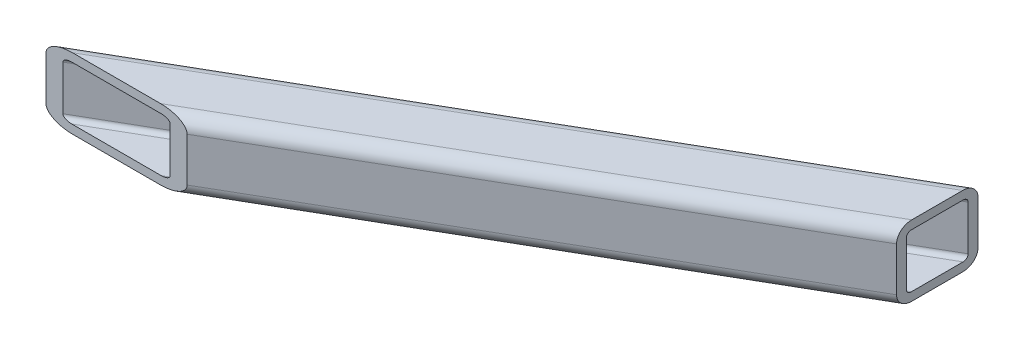
ISO-10303-21;
HEADER;
FILE_DESCRIPTION(('STEP AP214'),'2;1');
FILE_NAME('part.step','',(''),(''),'','','');
FILE_SCHEMA(('AUTOMOTIVE_DESIGN { 1 0 10303 214 1 1 1 1 }'));
ENDSEC;
DATA;
#1=APPLICATION_CONTEXT('core data for automotive mechanical design processes');
#2=APPLICATION_PROTOCOL_DEFINITION('international standard','automotive_design',2000,#1);
#3=PRODUCT_CONTEXT('',#1,'mechanical');
#4=PRODUCT('Part','Part','',(#3));
#5=PRODUCT_RELATED_PRODUCT_CATEGORY('part','',(#4));
#6=PRODUCT_DEFINITION_FORMATION('','',#4);
#7=PRODUCT_DEFINITION_CONTEXT('part definition',#1,'design');
#8=PRODUCT_DEFINITION('design','',#6,#7);
#9=PRODUCT_DEFINITION_SHAPE('','',#8);
#10=(LENGTH_UNIT() NAMED_UNIT(*) SI_UNIT(.MILLI.,.METRE.));
#11=(NAMED_UNIT(*) PLANE_ANGLE_UNIT() SI_UNIT($,.RADIAN.));
#12=(NAMED_UNIT(*) SI_UNIT($,.STERADIAN.) SOLID_ANGLE_UNIT());
#13=UNCERTAINTY_MEASURE_WITH_UNIT(LENGTH_MEASURE(1.E-05),#10,'distance_accuracy_value','');
#14=(GEOMETRIC_REPRESENTATION_CONTEXT(3) GLOBAL_UNCERTAINTY_ASSIGNED_CONTEXT((#13)) GLOBAL_UNIT_ASSIGNED_CONTEXT((#10,
#11,#12)) REPRESENTATION_CONTEXT('',''));
#15=CARTESIAN_POINT('',(0.,0.,0.));
#16=DIRECTION('',(0.,0.,1.));
#17=DIRECTION('',(1.,0.,0.));
#18=AXIS2_PLACEMENT_3D('',#15,#16,#17);
#19=CARTESIAN_POINT('',(-457.48804108,20.6248,150.596388214495));
#20=DIRECTION('',(0.866025403784429,0.,-0.500000000000017));
#21=DIRECTION('',(-0.500000000000017,0.,-0.866025403784429));
#22=AXIS2_PLACEMENT_3D('',#19,#20,#21);
#23=CYLINDRICAL_SURFACE('',#22,4.7752);
#24=CARTESIAN_POINT('',(-174.650400000015,20.6248,-12.7));
#25=DIRECTION('',(0.,0.,1.));
#26=DIRECTION('',(1.,0.,0.));
#27=AXIS2_PLACEMENT_3D('',#24,#25,#26);
#28=ELLIPSE('',#27,9.55039999999967,4.7752);
#29=CARTESIAN_POINT('',(-165.099999999986,20.6248,-12.7000000000055));
#30=VERTEX_POINT('',#29);
#31=CARTESIAN_POINT('',(-174.650400000008,25.4,-12.7));
#32=VERTEX_POINT('',#31);
#33=EDGE_CURVE('E106',#30,#32,#28,.T.);
#34=ORIENTED_EDGE('',*,*,#33,.F.);
#35=DIRECTION('',(0.866025403784429,0.,-0.500000000000017));
#36=VECTOR('',#35,1.);
#37=CARTESIAN_POINT('',(-165.1,20.6248,-12.7));
#38=LINE('',#37,#36);
#39=CARTESIAN_POINT('',(-3.17500000000011,20.6248,-106.187442338539));
#40=VERTEX_POINT('',#39);
#41=EDGE_CURVE('E103',#40,#30,#38,.F.);
#42=ORIENTED_EDGE('',*,*,#41,.F.);
#43=CARTESIAN_POINT('',(-3.17500000000004,20.6248,-111.701368349412));
#44=DIRECTION('',(1.,0.,0.));
#45=DIRECTION('',(0.,0.,-1.));
#46=AXIS2_PLACEMENT_3D('',#43,#44,#45);
#47=ELLIPSE('',#46,5.51392601086866,4.7752);
#48=CARTESIAN_POINT('',(-3.17500000000004,25.4,-111.701368349403));
#49=VERTEX_POINT('',#48);
#50=EDGE_CURVE('E19',#49,#40,#47,.T.);
#51=ORIENTED_EDGE('',*,*,#50,.F.);
#52=DIRECTION('',(0.866025403784448,0.,-0.499999999999984));
#53=VECTOR('',#52,1.);
#54=CARTESIAN_POINT('',(-174.6504,25.4,-12.7));
#55=LINE('',#54,#53);
#56=EDGE_CURVE('E158',#32,#49,#55,.T.);
#57=ORIENTED_EDGE('',*,*,#56,.F.);
#58=EDGE_LOOP('',(#34,#42,#51,#57));
#59=FACE_BOUND('',#58,.T.);
#60=ADVANCED_FACE('F16',(#59),#23,.T.);
#61=CARTESIAN_POINT('',(0.,25.4,0.));
#62=DIRECTION('',(0.,1.,0.));
#63=DIRECTION('',(0.,0.,1.));
#64=AXIS2_PLACEMENT_3D('',#61,#62,#63);
#65=PLANE('',#64);
#66=DIRECTION('',(-0.866025403784429,0.,0.500000000000017));
#67=VECTOR('',#66,1.);
#68=CARTESIAN_POINT('',(275.976420360003,25.4,-291.171057692021));
#69=LINE('',#68,#67);
#70=CARTESIAN_POINT('',(-206.349600000006,25.4,-12.7));
#71=VERTEX_POINT('',#70);
#72=CARTESIAN_POINT('',(-3.17499999999999,25.4,-130.002910002503));
#73=VERTEX_POINT('',#72);
#74=EDGE_CURVE('E127',#71,#73,#69,.F.);
#75=ORIENTED_EDGE('',*,*,#74,.F.);
#76=DIRECTION('',(1.,0.,0.));
#77=VECTOR('',#76,1.);
#78=CARTESIAN_POINT('',(-215.9,25.4,-12.7));
#79=LINE('',#78,#77);
#80=EDGE_CURVE('E186',#32,#71,#79,.F.);
#81=ORIENTED_EDGE('',*,*,#80,.F.);
#82=ORIENTED_EDGE('',*,*,#56,.T.);
#83=DIRECTION('',(0.,0.,-1.));
#84=VECTOR('',#83,1.);
#85=CARTESIAN_POINT('',(-3.175,25.4,-106.187442338534));
#86=LINE('',#85,#84);
#87=EDGE_CURVE('E126',#73,#49,#86,.F.);
#88=ORIENTED_EDGE('',*,*,#87,.F.);
#89=EDGE_LOOP('',(#75,#81,#82,#88));
#90=FACE_BOUND('',#89,.T.);
#91=ADVANCED_FACE('F432',(#90),#65,.T.);
#92=CARTESIAN_POINT('',(0.,0.,0.));
#93=DIRECTION('',(0.,1.,0.));
#94=DIRECTION('',(0.,0.,1.));
#95=AXIS2_PLACEMENT_3D('',#92,#93,#94);
#96=PLANE('',#95);
#97=DIRECTION('',(1.,0.,0.));
#98=VECTOR('',#97,1.);
#99=CARTESIAN_POINT('',(-215.9,0.,-12.7));
#100=LINE('',#99,#98);
#101=CARTESIAN_POINT('',(-206.349600000008,0.,-12.7));
#102=VERTEX_POINT('',#101);
#103=CARTESIAN_POINT('',(-174.65039999997,0.,-12.7));
#104=VERTEX_POINT('',#103);
#105=EDGE_CURVE('E181',#102,#104,#100,.T.);
#106=ORIENTED_EDGE('',*,*,#105,.F.);
#107=DIRECTION('',(0.866025403784429,0.,-0.500000000000017));
#108=VECTOR('',#107,1.);
#109=CARTESIAN_POINT('',(-489.187241079997,0.,150.596388214501));
#110=LINE('',#109,#108);
#111=CARTESIAN_POINT('',(-3.17499999999995,0.,-130.002910002505));
#112=VERTEX_POINT('',#111);
#113=EDGE_CURVE('E188',#112,#102,#110,.F.);
#114=ORIENTED_EDGE('',*,*,#113,.F.);
#115=DIRECTION('',(0.,0.,-1.));
#116=VECTOR('',#115,1.);
#117=CARTESIAN_POINT('',(-3.175,0.,-106.187442338534));
#118=LINE('',#117,#116);
#119=CARTESIAN_POINT('',(-3.17499999999999,0.,-111.701368349386));
#120=VERTEX_POINT('',#119);
#121=EDGE_CURVE('E209',#120,#112,#118,.T.);
#122=ORIENTED_EDGE('',*,*,#121,.F.);
#123=DIRECTION('',(-0.866025403784429,0.,0.500000000000017));
#124=VECTOR('',#123,1.);
#125=CARTESIAN_POINT('',(275.976420359992,0.,-272.86951603891));
#126=LINE('',#125,#124);
#127=EDGE_CURVE('E111',#104,#120,#126,.F.);
#128=ORIENTED_EDGE('',*,*,#127,.F.);
#129=EDGE_LOOP('',(#106,#114,#122,#128));
#130=FACE_BOUND('',#129,.T.);
#131=ADVANCED_FACE('F424',(#130),#96,.F.);
#132=CARTESIAN_POINT('',(275.97642036,4.7752,-272.869516038896));
#133=DIRECTION('',(-0.866025403784429,0.,0.500000000000017));
#134=DIRECTION('',(0.500000000000017,0.,0.866025403784429));
#135=AXIS2_PLACEMENT_3D('',#132,#133,#134);
#136=CYLINDRICAL_SURFACE('',#135,4.7752);
#137=CARTESIAN_POINT('',(-3.17499999999998,4.7752,-111.701368349376));
#138=DIRECTION('',(1.,0.,0.));
#139=DIRECTION('',(0.,0.,1.));
#140=AXIS2_PLACEMENT_3D('',#137,#138,#139);
#141=ELLIPSE('',#140,5.51392601086866,4.7752);
#142=CARTESIAN_POINT('',(-3.17499999999998,4.7752,-106.187442338521));
#143=VERTEX_POINT('',#142);
#144=EDGE_CURVE('E120',#143,#120,#141,.T.);
#145=ORIENTED_EDGE('',*,*,#144,.F.);
#146=DIRECTION('',(0.866025403784429,0.,-0.500000000000017));
#147=VECTOR('',#146,1.);
#148=CARTESIAN_POINT('',(-165.1,4.7752,-12.7));
#149=LINE('',#148,#147);
#150=CARTESIAN_POINT('',(-165.099999999977,4.7752,-12.7));
#151=VERTEX_POINT('',#150);
#152=EDGE_CURVE('E110',#151,#143,#149,.T.);
#153=ORIENTED_EDGE('',*,*,#152,.F.);
#154=CARTESIAN_POINT('',(-174.650399999953,4.7752,-12.7));
#155=DIRECTION('',(0.,0.,1.));
#156=DIRECTION('',(-1.,0.,0.));
#157=AXIS2_PLACEMENT_3D('',#154,#155,#156);
#158=ELLIPSE('',#157,9.55039999999967,4.7752);
#159=EDGE_CURVE('E177',#104,#151,#158,.T.);
#160=ORIENTED_EDGE('',*,*,#159,.F.);
#161=ORIENTED_EDGE('',*,*,#127,.T.);
#162=EDGE_LOOP('',(#145,#153,#160,#161));
#163=FACE_BOUND('',#162,.T.);
#164=ADVANCED_FACE('F416',(#163),#136,.T.);
#165=CARTESIAN_POINT('',(-165.1,0.,-12.7));
#166=DIRECTION('',(0.500000000000017,0.,0.866025403784429));
#167=DIRECTION('',(0.866025403784429,0.,-0.500000000000017));
#168=AXIS2_PLACEMENT_3D('',#165,#166,#167);
#169=PLANE('',#168);
#170=ORIENTED_EDGE('',*,*,#152,.T.);
#171=DIRECTION('',(0.,1.,0.));
#172=VECTOR('',#171,1.);
#173=CARTESIAN_POINT('',(-3.175,0.,-106.187442338534));
#174=LINE('',#173,#172);
#175=EDGE_CURVE('E114',#40,#143,#174,.F.);
#176=ORIENTED_EDGE('',*,*,#175,.F.);
#177=ORIENTED_EDGE('',*,*,#41,.T.);
#178=DIRECTION('',(0.,1.,0.));
#179=VECTOR('',#178,1.);
#180=CARTESIAN_POINT('',(-165.099999999949,0.,-12.7));
#181=LINE('',#180,#179);
#182=EDGE_CURVE('E180',#151,#30,#181,.T.);
#183=ORIENTED_EDGE('',*,*,#182,.F.);
#184=EDGE_LOOP('',(#170,#176,#177,#183));
#185=FACE_BOUND('',#184,.T.);
#186=ADVANCED_FACE('F115',(#185),#169,.T.);
#187=CARTESIAN_POINT('',(0.,3.048,0.));
#188=DIRECTION('',(0.,1.,0.));
#189=DIRECTION('',(0.,0.,1.));
#190=AXIS2_PLACEMENT_3D('',#187,#188,#189);
#191=PLANE('',#190);
#192=DIRECTION('',(-0.866025403784429,0.,0.500000000000017));
#193=VECTOR('',#192,1.);
#194=CARTESIAN_POINT('',(274.133310000035,3.048,-271.658748808102));
#195=LINE('',#194,#193);
#196=CARTESIAN_POINT('',(-174.396400000113,3.048,-12.7));
#197=VERTEX_POINT('',#196);
#198=CARTESIAN_POINT('',(-3.17499999999999,3.048,-111.554721381095));
#199=VERTEX_POINT('',#198);
#200=EDGE_CURVE('E128',#197,#199,#195,.F.);
#201=ORIENTED_EDGE('',*,*,#200,.T.);
#202=DIRECTION('',(0.,0.,-1.));
#203=VECTOR('',#202,1.);
#204=CARTESIAN_POINT('',(-3.175,3.048,-106.187442338534));
#205=LINE('',#204,#203);
#206=CARTESIAN_POINT('',(-3.17500000000004,3.048,-130.14955697088));
#207=VERTEX_POINT('',#206);
#208=EDGE_CURVE('E195',#207,#199,#205,.F.);
#209=ORIENTED_EDGE('',*,*,#208,.F.);
#210=DIRECTION('',(0.866025403784429,0.,-0.500000000000017));
#211=VECTOR('',#210,1.);
#212=CARTESIAN_POINT('',(-483.911909999996,3.048,147.404027427023));
#213=LINE('',#212,#211);
#214=CARTESIAN_POINT('',(-206.603600000011,3.048,-12.7));
#215=VERTEX_POINT('',#214);
#216=EDGE_CURVE('E153',#207,#215,#213,.F.);
#217=ORIENTED_EDGE('',*,*,#216,.T.);
#218=DIRECTION('',(1.,0.,0.));
#219=VECTOR('',#218,1.);
#220=CARTESIAN_POINT('',(-215.9,3.048,-12.7));
#221=LINE('',#220,#219);
#222=EDGE_CURVE('E176',#197,#215,#221,.F.);
#223=ORIENTED_EDGE('',*,*,#222,.F.);
#224=EDGE_LOOP('',(#201,#209,#217,#223));
#225=FACE_BOUND('',#224,.T.);
#226=ADVANCED_FACE('F276',(#225),#191,.T.);
#227=CARTESIAN_POINT('',(-483.91191,4.6482,147.404027427017));
#228=DIRECTION('',(0.866025403784429,0.,-0.500000000000017));
#229=DIRECTION('',(-0.500000000000017,0.,-0.866025403784429));
#230=AXIS2_PLACEMENT_3D('',#227,#228,#229);
#231=CYLINDRICAL_SURFACE('',#230,1.6002);
#232=CARTESIAN_POINT('',(-3.17500000000004,4.6482,-130.149556970884));
#233=DIRECTION('',(1.,0.,0.));
#234=DIRECTION('',(0.,0.,-1.));
#235=AXIS2_PLACEMENT_3D('',#232,#233,#234);
#236=ELLIPSE('',#235,1.8477518015145,1.6002);
#237=CARTESIAN_POINT('',(-3.17500000000004,4.6482,-131.997308772391));
#238=VERTEX_POINT('',#237);
#239=EDGE_CURVE('E196',#238,#207,#236,.F.);
#240=ORIENTED_EDGE('',*,*,#239,.F.);
#241=DIRECTION('',(-0.866025403784429,0.,0.500000000000017));
#242=VECTOR('',#241,1.);
#243=CARTESIAN_POINT('',(-1.651,4.6482,-132.877190582629));
#244=LINE('',#243,#242);
#245=CARTESIAN_POINT('',(-209.804000000004,4.6482,-12.7));
#246=VERTEX_POINT('',#245);
#247=EDGE_CURVE('E150',#238,#246,#244,.T.);
#248=ORIENTED_EDGE('',*,*,#247,.T.);
#249=CARTESIAN_POINT('',(-206.603600000018,4.6482,-12.7));
#250=DIRECTION('',(0.,0.,1.));
#251=DIRECTION('',(1.,0.,0.));
#252=AXIS2_PLACEMENT_3D('',#249,#250,#251);
#253=ELLIPSE('',#252,3.20039999999989,1.6002);
#254=EDGE_CURVE('E173',#215,#246,#253,.F.);
#255=ORIENTED_EDGE('',*,*,#254,.F.);
#256=ORIENTED_EDGE('',*,*,#216,.F.);
#257=EDGE_LOOP('',(#240,#248,#255,#256));
#258=FACE_BOUND('',#257,.T.);
#259=ADVANCED_FACE('F286',(#258),#231,.F.);
#260=CARTESIAN_POINT('',(-1.651,0.,-132.877190582629));
#261=DIRECTION('',(-0.500000000000017,0.,-0.866025403784429));
#262=DIRECTION('',(-0.866025403784429,0.,0.500000000000017));
#263=AXIS2_PLACEMENT_3D('',#260,#261,#262);
#264=PLANE('',#263);
#265=DIRECTION('',(0.,1.,0.));
#266=VECTOR('',#265,1.);
#267=CARTESIAN_POINT('',(-3.175,0.,-131.997308772393));
#268=LINE('',#267,#266);
#269=CARTESIAN_POINT('',(-3.1750000000041,20.7518,-131.997308772419));
#270=VERTEX_POINT('',#269);
#271=EDGE_CURVE('E199',#270,#238,#268,.F.);
#272=ORIENTED_EDGE('',*,*,#271,.F.);
#273=DIRECTION('',(-0.866025403784429,0.,0.500000000000017));
#274=VECTOR('',#273,1.);
#275=CARTESIAN_POINT('',(273.33321,20.7518,-291.63939824908));
#276=LINE('',#275,#274);
#277=CARTESIAN_POINT('',(-209.804000000041,20.7518,-12.700000000008));
#278=VERTEX_POINT('',#277);
#279=EDGE_CURVE('E147',#270,#278,#276,.T.);
#280=ORIENTED_EDGE('',*,*,#279,.T.);
#281=DIRECTION('',(0.,1.,0.));
#282=VECTOR('',#281,1.);
#283=CARTESIAN_POINT('',(-209.804,0.,-12.7));
#284=LINE('',#283,#282);
#285=EDGE_CURVE('E172',#246,#278,#284,.T.);
#286=ORIENTED_EDGE('',*,*,#285,.F.);
#287=ORIENTED_EDGE('',*,*,#247,.F.);
#288=EDGE_LOOP('',(#272,#280,#286,#287));
#289=FACE_BOUND('',#288,.T.);
#290=ADVANCED_FACE('F290',(#289),#264,.F.);
#291=CARTESIAN_POINT('',(274.13331,20.7518,-290.253584397944));
#292=DIRECTION('',(-0.866025403784429,0.,0.500000000000017));
#293=DIRECTION('',(0.500000000000017,0.,0.866025403784429));
#294=AXIS2_PLACEMENT_3D('',#291,#292,#293);
#295=CYLINDRICAL_SURFACE('',#294,1.6002);
#296=CARTESIAN_POINT('',(-206.603600000074,20.7518,-12.7));
#297=DIRECTION('',(0.,0.,1.));
#298=DIRECTION('',(-1.,0.,0.));
#299=AXIS2_PLACEMENT_3D('',#296,#297,#298);
#300=ELLIPSE('',#299,3.20039999999989,1.6002);
#301=CARTESIAN_POINT('',(-206.603600000046,22.352,-12.7));
#302=VERTEX_POINT('',#301);
#303=EDGE_CURVE('E169',#278,#302,#300,.F.);
#304=ORIENTED_EDGE('',*,*,#303,.F.);
#305=ORIENTED_EDGE('',*,*,#279,.F.);
#306=CARTESIAN_POINT('',(-3.17499999999998,20.7518,-130.149556970917));
#307=DIRECTION('',(1.,0.,0.));
#308=DIRECTION('',(0.,0.,1.));
#309=AXIS2_PLACEMENT_3D('',#306,#307,#308);
#310=ELLIPSE('',#309,1.8477518015145,1.6002);
#311=CARTESIAN_POINT('',(-3.17499999999999,22.352,-130.149556970898));
#312=VERTEX_POINT('',#311);
#313=EDGE_CURVE('E200',#312,#270,#310,.F.);
#314=ORIENTED_EDGE('',*,*,#313,.F.);
#315=DIRECTION('',(-0.866025403784439,0.,0.5));
#316=VECTOR('',#315,1.);
#317=CARTESIAN_POINT('',(-3.17500000000508,22.352,-130.149556970876));
#318=LINE('',#317,#316);
#319=EDGE_CURVE('E144',#312,#302,#318,.T.);
#320=ORIENTED_EDGE('',*,*,#319,.T.);
#321=EDGE_LOOP('',(#304,#305,#314,#320));
#322=FACE_BOUND('',#321,.T.);
#323=ADVANCED_FACE('F293',(#322),#295,.F.);
#324=CARTESIAN_POINT('',(0.,22.352,0.));
#325=DIRECTION('',(0.,1.,0.));
#326=DIRECTION('',(0.,0.,1.));
#327=AXIS2_PLACEMENT_3D('',#324,#325,#326);
#328=PLANE('',#327);
#329=DIRECTION('',(1.,0.,0.));
#330=VECTOR('',#329,1.);
#331=CARTESIAN_POINT('',(-215.9,22.352,-12.7));
#332=LINE('',#331,#330);
#333=CARTESIAN_POINT('',(-174.3964,22.352,-12.7));
#334=VERTEX_POINT('',#333);
#335=EDGE_CURVE('E168',#302,#334,#332,.T.);
#336=ORIENTED_EDGE('',*,*,#335,.F.);
#337=ORIENTED_EDGE('',*,*,#319,.F.);
#338=DIRECTION('',(0.,0.,-1.));
#339=VECTOR('',#338,1.);
#340=CARTESIAN_POINT('',(-3.175,22.352,-106.187442338534));
#341=LINE('',#340,#339);
#342=CARTESIAN_POINT('',(-3.17499999999999,22.352,-111.554721381029));
#343=VERTEX_POINT('',#342);
#344=EDGE_CURVE('E203',#343,#312,#341,.T.);
#345=ORIENTED_EDGE('',*,*,#344,.F.);
#346=DIRECTION('',(0.866025403784429,0.,-0.500000000000017));
#347=VECTOR('',#346,1.);
#348=CARTESIAN_POINT('',(-451.704709999991,22.352,147.404027427032));
#349=LINE('',#348,#347);
#350=EDGE_CURVE('E141',#343,#334,#349,.F.);
#351=ORIENTED_EDGE('',*,*,#350,.T.);
#352=EDGE_LOOP('',(#336,#337,#345,#351));
#353=FACE_BOUND('',#352,.T.);
#354=ADVANCED_FACE('F297',(#353),#328,.F.);
#355=CARTESIAN_POINT('',(-451.70471,20.7518,147.404027427017));
#356=DIRECTION('',(0.866025403784429,0.,-0.500000000000017));
#357=DIRECTION('',(-0.500000000000017,0.,-0.866025403784429));
#358=AXIS2_PLACEMENT_3D('',#355,#356,#357);
#359=CYLINDRICAL_SURFACE('',#358,1.6002);
#360=CARTESIAN_POINT('',(-3.17499999999998,20.7518,-111.554721381039));
#361=DIRECTION('',(1.,0.,0.));
#362=DIRECTION('',(0.,0.,-1.));
#363=AXIS2_PLACEMENT_3D('',#360,#361,#362);
#364=ELLIPSE('',#363,1.8477518015145,1.6002);
#365=CARTESIAN_POINT('',(-3.17499999999998,20.7518,-109.706969579519));
#366=VERTEX_POINT('',#365);
#367=EDGE_CURVE('E204',#366,#343,#364,.F.);
#368=ORIENTED_EDGE('',*,*,#367,.F.);
#369=DIRECTION('',(0.866025403784429,0.,-0.500000000000017));
#370=VECTOR('',#369,1.);
#371=CARTESIAN_POINT('',(-166.624,20.7518,-15.3396454307341));
#372=LINE('',#371,#370);
#373=CARTESIAN_POINT('',(-171.196000000008,20.7518,-12.7));
#374=VERTEX_POINT('',#373);
#375=EDGE_CURVE('E138',#366,#374,#372,.F.);
#376=ORIENTED_EDGE('',*,*,#375,.T.);
#377=CARTESIAN_POINT('',(-174.396400000018,20.7518,-12.7));
#378=DIRECTION('',(0.,0.,1.));
#379=DIRECTION('',(1.,0.,0.));
#380=AXIS2_PLACEMENT_3D('',#377,#378,#379);
#381=ELLIPSE('',#380,3.20039999999989,1.6002);
#382=EDGE_CURVE('E165',#334,#374,#381,.F.);
#383=ORIENTED_EDGE('',*,*,#382,.F.);
#384=ORIENTED_EDGE('',*,*,#350,.F.);
#385=EDGE_LOOP('',(#368,#376,#383,#384));
#386=FACE_BOUND('',#385,.T.);
#387=ADVANCED_FACE('F298',(#386),#359,.F.);
#388=CARTESIAN_POINT('',(-166.624,0.,-15.3396454307341));
#389=DIRECTION('',(0.500000000000017,0.,0.866025403784429));
#390=DIRECTION('',(0.866025403784429,0.,-0.500000000000017));
#391=AXIS2_PLACEMENT_3D('',#388,#389,#390);
#392=PLANE('',#391);
#393=DIRECTION('',(0.,1.,0.));
#394=VECTOR('',#393,1.);
#395=CARTESIAN_POINT('',(-171.196,0.,-12.7));
#396=LINE('',#395,#394);
#397=CARTESIAN_POINT('',(-171.196000000103,4.6482,-12.7000000000198));
#398=VERTEX_POINT('',#397);
#399=EDGE_CURVE('E164',#374,#398,#396,.F.);
#400=ORIENTED_EDGE('',*,*,#399,.F.);
#401=ORIENTED_EDGE('',*,*,#375,.F.);
#402=DIRECTION('',(0.,1.,0.));
#403=VECTOR('',#402,1.);
#404=CARTESIAN_POINT('',(-3.175,0.,-109.706969579526));
#405=LINE('',#404,#403);
#406=CARTESIAN_POINT('',(-3.17500000001019,4.6482,-109.706969579591));
#407=VERTEX_POINT('',#406);
#408=EDGE_CURVE('E207',#407,#366,#405,.T.);
#409=ORIENTED_EDGE('',*,*,#408,.F.);
#410=DIRECTION('',(-0.866025403784429,0.,0.500000000000017));
#411=VECTOR('',#410,1.);
#412=CARTESIAN_POINT('',(274.93341,4.6482,-270.272934957026));
#413=LINE('',#412,#411);
#414=EDGE_CURVE('E132',#407,#398,#413,.T.);
#415=ORIENTED_EDGE('',*,*,#414,.T.);
#416=EDGE_LOOP('',(#400,#401,#409,#415));
#417=FACE_BOUND('',#416,.T.);
#418=ADVANCED_FACE('F252',(#417),#392,.F.);
#419=CARTESIAN_POINT('',(274.13331,4.6482,-271.658748808162));
#420=DIRECTION('',(-0.866025403784429,0.,0.500000000000017));
#421=DIRECTION('',(0.500000000000017,0.,0.866025403784429));
#422=AXIS2_PLACEMENT_3D('',#419,#420,#421);
#423=CYLINDRICAL_SURFACE('',#422,1.6002);
#424=CARTESIAN_POINT('',(-174.396400000183,4.6482,-12.7));
#425=DIRECTION('',(0.,0.,1.));
#426=DIRECTION('',(-1.,0.,0.));
#427=AXIS2_PLACEMENT_3D('',#424,#425,#426);
#428=ELLIPSE('',#427,3.20039999999989,1.6002);
#429=EDGE_CURVE('E160',#398,#197,#428,.F.);
#430=ORIENTED_EDGE('',*,*,#429,.F.);
#431=ORIENTED_EDGE('',*,*,#414,.F.);
#432=CARTESIAN_POINT('',(-3.17499999999998,4.6482,-111.554721381135));
#433=DIRECTION('',(1.,0.,0.));
#434=DIRECTION('',(0.,0.,1.));
#435=AXIS2_PLACEMENT_3D('',#432,#433,#434);
#436=ELLIPSE('',#435,1.8477518015145,1.6002);
#437=EDGE_CURVE('E192',#199,#407,#436,.F.);
#438=ORIENTED_EDGE('',*,*,#437,.F.);
#439=ORIENTED_EDGE('',*,*,#200,.F.);
#440=EDGE_LOOP('',(#430,#431,#438,#439));
#441=FACE_BOUND('',#440,.T.);
#442=ADVANCED_FACE('F281',(#441),#423,.F.);
#443=CARTESIAN_POINT('',(275.97642036,20.6248,-291.171057692026));
#444=DIRECTION('',(-0.866025403784429,0.,0.500000000000017));
#445=DIRECTION('',(0.500000000000017,0.,0.866025403784429));
#446=AXIS2_PLACEMENT_3D('',#443,#444,#445);
#447=CYLINDRICAL_SURFACE('',#446,4.7752);
#448=CARTESIAN_POINT('',(-3.17499999999998,20.6248,-130.002910002506));
#449=DIRECTION('',(1.,0.,0.));
#450=DIRECTION('',(0.,0.,1.));
#451=AXIS2_PLACEMENT_3D('',#448,#449,#450);
#452=ELLIPSE('',#451,5.51392601086866,4.7752);
#453=CARTESIAN_POINT('',(-3.17499999999998,20.6248,-135.516836013368));
#454=VERTEX_POINT('',#453);
#455=EDGE_CURVE('E208',#454,#73,#452,.T.);
#456=ORIENTED_EDGE('',*,*,#455,.F.);
#457=DIRECTION('',(-0.866025403784429,0.,0.500000000000017));
#458=VECTOR('',#457,1.);
#459=CARTESIAN_POINT('',(-3.175,20.6248,-135.51683601336));
#460=LINE('',#459,#458);
#461=CARTESIAN_POINT('',(-215.9,20.6248,-12.6999999999913));
#462=VERTEX_POINT('',#461);
#463=EDGE_CURVE('E163',#462,#454,#460,.F.);
#464=ORIENTED_EDGE('',*,*,#463,.F.);
#465=CARTESIAN_POINT('',(-206.349600000011,20.6248,-12.7));
#466=DIRECTION('',(0.,0.,1.));
#467=DIRECTION('',(-1.,0.,0.));
#468=AXIS2_PLACEMENT_3D('',#465,#466,#467);
#469=ELLIPSE('',#468,9.55039999999967,4.7752);
#470=EDGE_CURVE('E183',#71,#462,#469,.T.);
#471=ORIENTED_EDGE('',*,*,#470,.F.);
#472=ORIENTED_EDGE('',*,*,#74,.T.);
#473=EDGE_LOOP('',(#456,#464,#471,#472));
#474=FACE_BOUND('',#473,.T.);
#475=ADVANCED_FACE('F322',(#474),#447,.T.);
#476=CARTESIAN_POINT('',(-3.175,0.,-106.187442338534));
#477=DIRECTION('',(1.,0.,0.));
#478=DIRECTION('',(0.,0.,-1.));
#479=AXIS2_PLACEMENT_3D('',#476,#477,#478);
#480=PLANE('',#479);
#481=ORIENTED_EDGE('',*,*,#208,.T.);
#482=ORIENTED_EDGE('',*,*,#437,.T.);
#483=ORIENTED_EDGE('',*,*,#408,.T.);
#484=ORIENTED_EDGE('',*,*,#367,.T.);
#485=ORIENTED_EDGE('',*,*,#344,.T.);
#486=ORIENTED_EDGE('',*,*,#313,.T.);
#487=ORIENTED_EDGE('',*,*,#271,.T.);
#488=ORIENTED_EDGE('',*,*,#239,.T.);
#489=EDGE_LOOP('',(#481,#482,#483,#484,#485,#486,#487,#488));
#490=FACE_BOUND('',#489,.T.);
#491=ORIENTED_EDGE('',*,*,#455,.T.);
#492=ORIENTED_EDGE('',*,*,#87,.T.);
#493=ORIENTED_EDGE('',*,*,#50,.T.);
#494=ORIENTED_EDGE('',*,*,#175,.T.);
#495=ORIENTED_EDGE('',*,*,#144,.T.);
#496=ORIENTED_EDGE('',*,*,#121,.T.);
#497=CARTESIAN_POINT('',(-3.17499999999993,4.7752,-130.002910002509));
#498=DIRECTION('',(1.,0.,0.));
#499=DIRECTION('',(0.,0.,-1.));
#500=AXIS2_PLACEMENT_3D('',#497,#498,#499);
#501=ELLIPSE('',#500,5.51392601086866,4.7752);
#502=CARTESIAN_POINT('',(-3.17499999999993,4.7752,-135.516836013369));
#503=VERTEX_POINT('',#502);
#504=EDGE_CURVE('E189',#503,#112,#501,.F.);
#505=ORIENTED_EDGE('',*,*,#504,.F.);
#506=DIRECTION('',(0.,1.,0.));
#507=VECTOR('',#506,1.);
#508=CARTESIAN_POINT('',(-3.17499999998899,0.,-135.516836013367));
#509=LINE('',#508,#507);
#510=EDGE_CURVE('E222',#454,#503,#509,.F.);
#511=ORIENTED_EDGE('',*,*,#510,.F.);
#512=EDGE_LOOP('',(#491,#492,#493,#494,#495,#496,#505,#511));
#513=FACE_BOUND('',#512,.T.);
#514=ADVANCED_FACE('F124',(#490,#513),#480,.T.);
#515=CARTESIAN_POINT('',(-489.18724108,4.7752,150.596388214495));
#516=DIRECTION('',(0.866025403784429,0.,-0.500000000000017));
#517=DIRECTION('',(-0.500000000000017,0.,-0.866025403784429));
#518=AXIS2_PLACEMENT_3D('',#515,#516,#517);
#519=CYLINDRICAL_SURFACE('',#518,4.7752);
#520=CARTESIAN_POINT('',(-206.349600000015,4.7752,-12.7));
#521=DIRECTION('',(0.,0.,1.));
#522=DIRECTION('',(1.,0.,0.));
#523=AXIS2_PLACEMENT_3D('',#520,#521,#522);
#524=ELLIPSE('',#523,9.55039999999967,4.7752);
#525=CARTESIAN_POINT('',(-215.9,4.7752,-12.6999999999913));
#526=VERTEX_POINT('',#525);
#527=EDGE_CURVE('E34',#526,#102,#524,.T.);
#528=ORIENTED_EDGE('',*,*,#527,.F.);
#529=DIRECTION('',(-0.866025403784429,0.,0.500000000000017));
#530=VECTOR('',#529,1.);
#531=CARTESIAN_POINT('',(-3.175,4.7752,-135.51683601336));
#532=LINE('',#531,#530);
#533=EDGE_CURVE('E25',#503,#526,#532,.T.);
#534=ORIENTED_EDGE('',*,*,#533,.F.);
#535=ORIENTED_EDGE('',*,*,#504,.T.);
#536=ORIENTED_EDGE('',*,*,#113,.T.);
#537=EDGE_LOOP('',(#528,#534,#535,#536));
#538=FACE_BOUND('',#537,.T.);
#539=ADVANCED_FACE('F315',(#538),#519,.T.);
#540=CARTESIAN_POINT('',(-215.9,0.,-12.7));
#541=DIRECTION('',(0.,0.,1.));
#542=DIRECTION('',(1.,0.,0.));
#543=AXIS2_PLACEMENT_3D('',#540,#541,#542);
#544=PLANE('',#543);
#545=ORIENTED_EDGE('',*,*,#399,.T.);
#546=ORIENTED_EDGE('',*,*,#429,.T.);
#547=ORIENTED_EDGE('',*,*,#222,.T.);
#548=ORIENTED_EDGE('',*,*,#254,.T.);
#549=ORIENTED_EDGE('',*,*,#285,.T.);
#550=ORIENTED_EDGE('',*,*,#303,.T.);
#551=ORIENTED_EDGE('',*,*,#335,.T.);
#552=ORIENTED_EDGE('',*,*,#382,.T.);
#553=EDGE_LOOP('',(#545,#546,#547,#548,#549,#550,#551,#552));
#554=FACE_BOUND('',#553,.T.);
#555=ORIENTED_EDGE('',*,*,#159,.T.);
#556=ORIENTED_EDGE('',*,*,#182,.T.);
#557=ORIENTED_EDGE('',*,*,#33,.T.);
#558=ORIENTED_EDGE('',*,*,#80,.T.);
#559=ORIENTED_EDGE('',*,*,#470,.T.);
#560=DIRECTION('',(0.,1.,0.));
#561=VECTOR('',#560,1.);
#562=CARTESIAN_POINT('',(-215.900000000015,0.,-12.6999999999826));
#563=LINE('',#562,#561);
#564=EDGE_CURVE('E11',#526,#462,#563,.T.);
#565=ORIENTED_EDGE('',*,*,#564,.F.);
#566=ORIENTED_EDGE('',*,*,#527,.T.);
#567=ORIENTED_EDGE('',*,*,#105,.T.);
#568=EDGE_LOOP('',(#555,#556,#557,#558,#559,#565,#566,#567));
#569=FACE_BOUND('',#568,.T.);
#570=ADVANCED_FACE('F244',(#554,#569),#544,.T.);
#571=CARTESIAN_POINT('',(-3.175,0.,-135.51683601336));
#572=DIRECTION('',(-0.500000000000017,0.,-0.866025403784429));
#573=DIRECTION('',(-0.866025403784429,0.,0.500000000000017));
#574=AXIS2_PLACEMENT_3D('',#571,#572,#573);
#575=PLANE('',#574);
#576=ORIENTED_EDGE('',*,*,#533,.T.);
#577=ORIENTED_EDGE('',*,*,#564,.T.);
#578=ORIENTED_EDGE('',*,*,#463,.T.);
#579=ORIENTED_EDGE('',*,*,#510,.T.);
#580=EDGE_LOOP('',(#576,#577,#578,#579));
#581=FACE_BOUND('',#580,.T.);
#582=ADVANCED_FACE('F308',(#581),#575,.T.);
#583=CLOSED_SHELL('',(#60,#91,#131,#164,#186,#226,#259,#290,#323,#354,#387,#418,#442,#475,#514,
#539,#570,#582));
#584=MANIFOLD_SOLID_BREP('B1',#583);
#585=ADVANCED_BREP_SHAPE_REPRESENTATION('',(#18,#584),#14);
#586=SHAPE_DEFINITION_REPRESENTATION(#9,#585);
ENDSEC;
END-ISO-10303-21;
